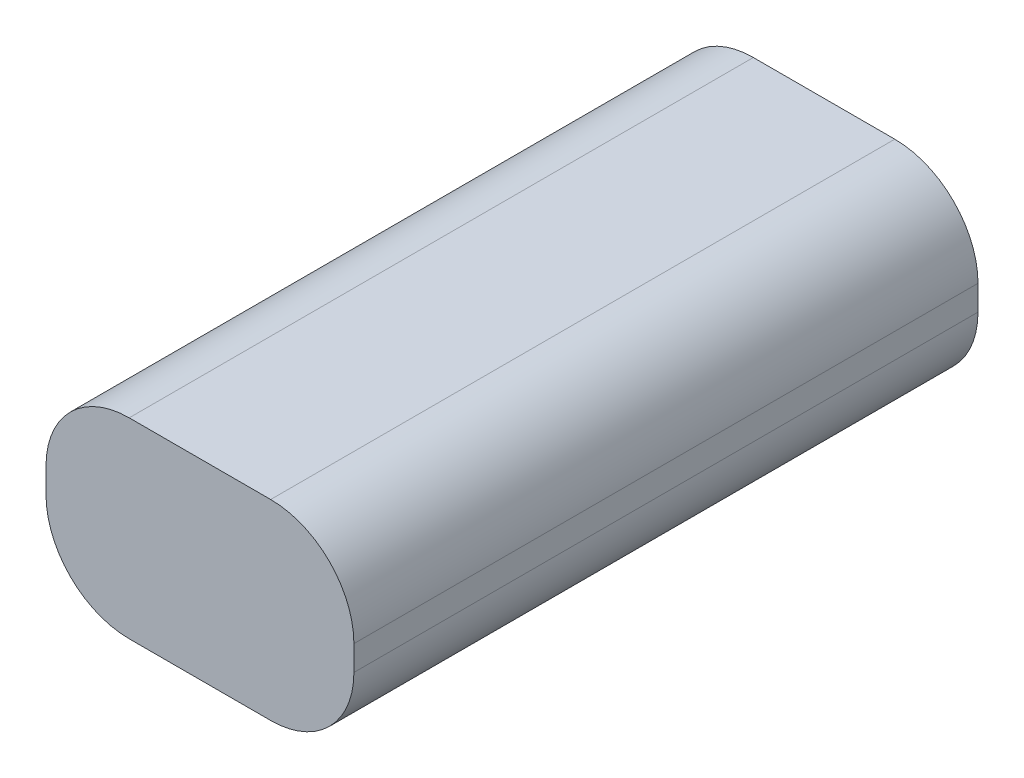
ISO-10303-21;
HEADER;
FILE_DESCRIPTION(('STEP AP214'),'2;1');
FILE_NAME('part.step','',(''),(''),'','','');
FILE_SCHEMA(('AUTOMOTIVE_DESIGN { 1 0 10303 214 1 1 1 1 }'));
ENDSEC;
DATA;
#1=APPLICATION_CONTEXT('core data for automotive mechanical design processes');
#2=APPLICATION_PROTOCOL_DEFINITION('international standard','automotive_design',2000,#1);
#3=PRODUCT_CONTEXT('',#1,'mechanical');
#4=PRODUCT('Part','Part','',(#3));
#5=PRODUCT_RELATED_PRODUCT_CATEGORY('part','',(#4));
#6=PRODUCT_DEFINITION_FORMATION('','',#4);
#7=PRODUCT_DEFINITION_CONTEXT('part definition',#1,'design');
#8=PRODUCT_DEFINITION('design','',#6,#7);
#9=PRODUCT_DEFINITION_SHAPE('','',#8);
#10=(LENGTH_UNIT() NAMED_UNIT(*) SI_UNIT(.MILLI.,.METRE.));
#11=(NAMED_UNIT(*) PLANE_ANGLE_UNIT() SI_UNIT($,.RADIAN.));
#12=(NAMED_UNIT(*) SI_UNIT($,.STERADIAN.) SOLID_ANGLE_UNIT());
#13=UNCERTAINTY_MEASURE_WITH_UNIT(LENGTH_MEASURE(1.E-05),#10,'distance_accuracy_value','');
#14=(GEOMETRIC_REPRESENTATION_CONTEXT(3) GLOBAL_UNCERTAINTY_ASSIGNED_CONTEXT((#13)) GLOBAL_UNIT_ASSIGNED_CONTEXT((#10,
#11,#12)) REPRESENTATION_CONTEXT('',''));
#15=CARTESIAN_POINT('',(0.,0.,0.));
#16=DIRECTION('',(0.,0.,1.));
#17=DIRECTION('',(1.,0.,0.));
#18=AXIS2_PLACEMENT_3D('',#15,#16,#17);
#19=CARTESIAN_POINT('',(18.5,23.,-37.5));
#20=DIRECTION('',(-1.,0.,0.));
#21=DIRECTION('',(0.,0.,1.));
#22=AXIS2_PLACEMENT_3D('',#19,#20,#21);
#23=PLANE('',#22);
#24=DIRECTION('',(0.,-1.,0.));
#25=VECTOR('',#24,1.);
#26=CARTESIAN_POINT('',(18.5,23.,37.5));
#27=LINE('',#26,#25);
#28=CARTESIAN_POINT('',(18.5,13.,37.5));
#29=VERTEX_POINT('',#28);
#30=CARTESIAN_POINT('',(18.5,10.,37.5));
#31=VERTEX_POINT('',#30);
#32=EDGE_CURVE('E134',#29,#31,#27,.T.);
#33=ORIENTED_EDGE('',*,*,#32,.T.);
#34=DIRECTION('',(0.,0.,-1.));
#35=VECTOR('',#34,1.);
#36=CARTESIAN_POINT('',(18.5,10.,-37.5));
#37=LINE('',#36,#35);
#38=CARTESIAN_POINT('',(18.5,10.,-37.5));
#39=VERTEX_POINT('',#38);
#40=EDGE_CURVE('E11',#31,#39,#37,.T.);
#41=ORIENTED_EDGE('',*,*,#40,.T.);
#42=DIRECTION('',(0.,-1.,0.));
#43=VECTOR('',#42,1.);
#44=CARTESIAN_POINT('',(18.5,23.,-37.5));
#45=LINE('',#44,#43);
#46=CARTESIAN_POINT('',(18.5,13.,-37.5));
#47=VERTEX_POINT('',#46);
#48=EDGE_CURVE('E140',#47,#39,#45,.T.);
#49=ORIENTED_EDGE('',*,*,#48,.F.);
#50=DIRECTION('',(0.,0.,-1.));
#51=VECTOR('',#50,1.);
#52=CARTESIAN_POINT('',(18.5,13.,37.5));
#53=LINE('',#52,#51);
#54=EDGE_CURVE('E52',#47,#29,#53,.F.);
#55=ORIENTED_EDGE('',*,*,#54,.T.);
#56=EDGE_LOOP('',(#33,#41,#49,#55));
#57=FACE_BOUND('',#56,.T.);
#58=ADVANCED_FACE('F43',(#57),#23,.F.);
#59=CARTESIAN_POINT('',(-18.5,23.,-37.5));
#60=DIRECTION('',(0.,0.,1.));
#61=DIRECTION('',(1.,0.,0.));
#62=AXIS2_PLACEMENT_3D('',#59,#60,#61);
#63=PLANE('',#62);
#64=DIRECTION('',(-1.,0.,0.));
#65=VECTOR('',#64,1.);
#66=CARTESIAN_POINT('',(-18.5,0.,-37.5));
#67=LINE('',#66,#65);
#68=CARTESIAN_POINT('',(8.49999999999999,0.,-37.5));
#69=VERTEX_POINT('',#68);
#70=CARTESIAN_POINT('',(-8.50000000000001,0.,-37.5));
#71=VERTEX_POINT('',#70);
#72=EDGE_CURVE('E200',#69,#71,#67,.T.);
#73=ORIENTED_EDGE('',*,*,#72,.T.);
#74=CARTESIAN_POINT('',(-8.50000000000001,10.,-37.5));
#75=DIRECTION('',(0.,0.,1.));
#76=DIRECTION('',(1.,0.,0.));
#77=AXIS2_PLACEMENT_3D('',#74,#75,#76);
#78=CIRCLE('',#77,10.);
#79=CARTESIAN_POINT('',(-18.5,10.,-37.5));
#80=VERTEX_POINT('',#79);
#81=EDGE_CURVE('E167',#71,#80,#78,.F.);
#82=ORIENTED_EDGE('',*,*,#81,.T.);
#83=DIRECTION('',(0.,-1.,0.));
#84=VECTOR('',#83,1.);
#85=CARTESIAN_POINT('',(-18.5,23.,-37.5));
#86=LINE('',#85,#84);
#87=CARTESIAN_POINT('',(-18.5,13.,-37.5));
#88=VERTEX_POINT('',#87);
#89=EDGE_CURVE('E133',#88,#80,#86,.T.);
#90=ORIENTED_EDGE('',*,*,#89,.F.);
#91=CARTESIAN_POINT('',(-8.50000000000001,13.,-37.5));
#92=DIRECTION('',(0.,0.,1.));
#93=DIRECTION('',(1.,0.,0.));
#94=AXIS2_PLACEMENT_3D('',#91,#92,#93);
#95=CIRCLE('',#94,10.);
#96=CARTESIAN_POINT('',(-8.50000000000001,23.,-37.5));
#97=VERTEX_POINT('',#96);
#98=EDGE_CURVE('E138',#88,#97,#95,.F.);
#99=ORIENTED_EDGE('',*,*,#98,.T.);
#100=DIRECTION('',(-1.,0.,0.));
#101=VECTOR('',#100,1.);
#102=CARTESIAN_POINT('',(-18.5,23.,-37.5));
#103=LINE('',#102,#101);
#104=CARTESIAN_POINT('',(8.49999999999999,23.,-37.5));
#105=VERTEX_POINT('',#104);
#106=EDGE_CURVE('E191',#105,#97,#103,.T.);
#107=ORIENTED_EDGE('',*,*,#106,.F.);
#108=CARTESIAN_POINT('',(8.49999999999999,13.,-37.5));
#109=DIRECTION('',(0.,0.,1.));
#110=DIRECTION('',(1.,0.,0.));
#111=AXIS2_PLACEMENT_3D('',#108,#109,#110);
#112=CIRCLE('',#111,10.);
#113=EDGE_CURVE('E66',#105,#47,#112,.F.);
#114=ORIENTED_EDGE('',*,*,#113,.T.);
#115=ORIENTED_EDGE('',*,*,#48,.T.);
#116=CARTESIAN_POINT('',(8.49999999999999,10.,-37.5));
#117=DIRECTION('',(0.,0.,1.));
#118=DIRECTION('',(1.,0.,0.));
#119=AXIS2_PLACEMENT_3D('',#116,#117,#118);
#120=CIRCLE('',#119,10.);
#121=EDGE_CURVE('E59',#39,#69,#120,.F.);
#122=ORIENTED_EDGE('',*,*,#121,.T.);
#123=EDGE_LOOP('',(#73,#82,#90,#99,#107,#114,#115,#122));
#124=FACE_BOUND('',#123,.T.);
#125=ADVANCED_FACE('F193',(#124),#63,.F.);
#126=CARTESIAN_POINT('',(-18.5,23.,-37.5));
#127=DIRECTION('',(1.,0.,0.));
#128=DIRECTION('',(0.,0.,-1.));
#129=AXIS2_PLACEMENT_3D('',#126,#127,#128);
#130=PLANE('',#129);
#131=ORIENTED_EDGE('',*,*,#89,.T.);
#132=DIRECTION('',(0.,0.,1.));
#133=VECTOR('',#132,1.);
#134=CARTESIAN_POINT('',(-18.5,10.,-37.5));
#135=LINE('',#134,#133);
#136=CARTESIAN_POINT('',(-18.5,10.,37.5));
#137=VERTEX_POINT('',#136);
#138=EDGE_CURVE('E131',#80,#137,#135,.T.);
#139=ORIENTED_EDGE('',*,*,#138,.T.);
#140=DIRECTION('',(0.,-1.,0.));
#141=VECTOR('',#140,1.);
#142=CARTESIAN_POINT('',(-18.5,23.,37.5));
#143=LINE('',#142,#141);
#144=CARTESIAN_POINT('',(-18.5,13.,37.5));
#145=VERTEX_POINT('',#144);
#146=EDGE_CURVE('E113',#145,#137,#143,.T.);
#147=ORIENTED_EDGE('',*,*,#146,.F.);
#148=DIRECTION('',(0.,0.,1.));
#149=VECTOR('',#148,1.);
#150=CARTESIAN_POINT('',(-18.5,13.,-37.5));
#151=LINE('',#150,#149);
#152=EDGE_CURVE('E128',#145,#88,#151,.F.);
#153=ORIENTED_EDGE('',*,*,#152,.T.);
#154=EDGE_LOOP('',(#131,#139,#147,#153));
#155=FACE_BOUND('',#154,.T.);
#156=ADVANCED_FACE('F127',(#155),#130,.F.);
#157=CARTESIAN_POINT('',(-18.5,23.,37.5));
#158=DIRECTION('',(0.,0.,-1.));
#159=DIRECTION('',(-1.,0.,0.));
#160=AXIS2_PLACEMENT_3D('',#157,#158,#159);
#161=PLANE('',#160);
#162=ORIENTED_EDGE('',*,*,#146,.T.);
#163=CARTESIAN_POINT('',(-8.49999999999999,10.,37.5));
#164=DIRECTION('',(0.,0.,-1.));
#165=DIRECTION('',(-1.,0.,0.));
#166=AXIS2_PLACEMENT_3D('',#163,#164,#165);
#167=CIRCLE('',#166,10.);
#168=CARTESIAN_POINT('',(-8.49999999999999,0.,37.5));
#169=VERTEX_POINT('',#168);
#170=EDGE_CURVE('E121',#137,#169,#167,.F.);
#171=ORIENTED_EDGE('',*,*,#170,.T.);
#172=DIRECTION('',(1.,0.,0.));
#173=VECTOR('',#172,1.);
#174=CARTESIAN_POINT('',(-18.5,0.,37.5));
#175=LINE('',#174,#173);
#176=CARTESIAN_POINT('',(8.5,0.,37.5));
#177=VERTEX_POINT('',#176);
#178=EDGE_CURVE('E195',#169,#177,#175,.T.);
#179=ORIENTED_EDGE('',*,*,#178,.T.);
#180=CARTESIAN_POINT('',(8.5,10.,37.5));
#181=DIRECTION('',(0.,0.,-1.));
#182=DIRECTION('',(-1.,0.,0.));
#183=AXIS2_PLACEMENT_3D('',#180,#181,#182);
#184=CIRCLE('',#183,10.);
#185=EDGE_CURVE('E122',#177,#31,#184,.F.);
#186=ORIENTED_EDGE('',*,*,#185,.T.);
#187=ORIENTED_EDGE('',*,*,#32,.F.);
#188=CARTESIAN_POINT('',(8.5,13.,37.5));
#189=DIRECTION('',(0.,0.,-1.));
#190=DIRECTION('',(-1.,0.,0.));
#191=AXIS2_PLACEMENT_3D('',#188,#189,#190);
#192=CIRCLE('',#191,10.);
#193=CARTESIAN_POINT('',(8.5,23.,37.5));
#194=VERTEX_POINT('',#193);
#195=EDGE_CURVE('E144',#29,#194,#192,.F.);
#196=ORIENTED_EDGE('',*,*,#195,.T.);
#197=DIRECTION('',(1.,0.,0.));
#198=VECTOR('',#197,1.);
#199=CARTESIAN_POINT('',(-18.5,23.,37.5));
#200=LINE('',#199,#198);
#201=CARTESIAN_POINT('',(-8.49999999999999,23.,37.5));
#202=VERTEX_POINT('',#201);
#203=EDGE_CURVE('E115',#202,#194,#200,.T.);
#204=ORIENTED_EDGE('',*,*,#203,.F.);
#205=CARTESIAN_POINT('',(-8.49999999999999,13.,37.5));
#206=DIRECTION('',(0.,0.,-1.));
#207=DIRECTION('',(-1.,0.,0.));
#208=AXIS2_PLACEMENT_3D('',#205,#206,#207);
#209=CIRCLE('',#208,10.);
#210=EDGE_CURVE('E110',#202,#145,#209,.F.);
#211=ORIENTED_EDGE('',*,*,#210,.T.);
#212=EDGE_LOOP('',(#162,#171,#179,#186,#187,#196,#204,#211));
#213=FACE_BOUND('',#212,.T.);
#214=ADVANCED_FACE('F112',(#213),#161,.F.);
#215=CARTESIAN_POINT('',(0.,23.,0.));
#216=DIRECTION('',(0.,1.,0.));
#217=DIRECTION('',(0.,0.,1.));
#218=AXIS2_PLACEMENT_3D('',#215,#216,#217);
#219=PLANE('',#218);
#220=ORIENTED_EDGE('',*,*,#106,.T.);
#221=DIRECTION('',(0.,0.,1.));
#222=VECTOR('',#221,1.);
#223=CARTESIAN_POINT('',(-8.49999999999999,23.,37.5));
#224=LINE('',#223,#222);
#225=EDGE_CURVE('E174',#97,#202,#224,.T.);
#226=ORIENTED_EDGE('',*,*,#225,.T.);
#227=ORIENTED_EDGE('',*,*,#203,.T.);
#228=DIRECTION('',(0.,0.,-1.));
#229=VECTOR('',#228,1.);
#230=CARTESIAN_POINT('',(8.49999999999999,23.,-37.5));
#231=LINE('',#230,#229);
#232=EDGE_CURVE('E170',#194,#105,#231,.T.);
#233=ORIENTED_EDGE('',*,*,#232,.T.);
#234=EDGE_LOOP('',(#220,#226,#227,#233));
#235=FACE_BOUND('',#234,.T.);
#236=ADVANCED_FACE('F190',(#235),#219,.T.);
#237=CARTESIAN_POINT('',(0.,0.,0.));
#238=DIRECTION('',(0.,1.,0.));
#239=DIRECTION('',(0.,0.,1.));
#240=AXIS2_PLACEMENT_3D('',#237,#238,#239);
#241=PLANE('',#240);
#242=ORIENTED_EDGE('',*,*,#178,.F.);
#243=DIRECTION('',(0.,0.,1.));
#244=VECTOR('',#243,1.);
#245=CARTESIAN_POINT('',(-8.5,0.,0.));
#246=LINE('',#245,#244);
#247=EDGE_CURVE('E158',#169,#71,#246,.F.);
#248=ORIENTED_EDGE('',*,*,#247,.T.);
#249=ORIENTED_EDGE('',*,*,#72,.F.);
#250=DIRECTION('',(0.,0.,-1.));
#251=VECTOR('',#250,1.);
#252=CARTESIAN_POINT('',(8.49999999999999,0.,0.));
#253=LINE('',#252,#251);
#254=EDGE_CURVE('E155',#69,#177,#253,.F.);
#255=ORIENTED_EDGE('',*,*,#254,.T.);
#256=EDGE_LOOP('',(#242,#248,#249,#255));
#257=FACE_BOUND('',#256,.T.);
#258=ADVANCED_FACE('F211',(#257),#241,.F.);
#259=CARTESIAN_POINT('',(-8.50000000000001,10.,-37.5));
#260=DIRECTION('',(0.,0.,1.));
#261=DIRECTION('',(1.,0.,0.));
#262=AXIS2_PLACEMENT_3D('',#259,#260,#261);
#263=CYLINDRICAL_SURFACE('',#262,10.);
#264=ORIENTED_EDGE('',*,*,#81,.F.);
#265=ORIENTED_EDGE('',*,*,#247,.F.);
#266=ORIENTED_EDGE('',*,*,#170,.F.);
#267=ORIENTED_EDGE('',*,*,#138,.F.);
#268=EDGE_LOOP('',(#264,#265,#266,#267));
#269=FACE_BOUND('',#268,.T.);
#270=ADVANCED_FACE('F207',(#269),#263,.T.);
#271=CARTESIAN_POINT('',(-8.5,13.,0.));
#272=DIRECTION('',(0.,0.,-1.));
#273=DIRECTION('',(-1.,0.,0.));
#274=AXIS2_PLACEMENT_3D('',#271,#272,#273);
#275=CYLINDRICAL_SURFACE('',#274,10.);
#276=ORIENTED_EDGE('',*,*,#98,.F.);
#277=ORIENTED_EDGE('',*,*,#152,.F.);
#278=ORIENTED_EDGE('',*,*,#210,.F.);
#279=ORIENTED_EDGE('',*,*,#225,.F.);
#280=EDGE_LOOP('',(#276,#277,#278,#279));
#281=FACE_BOUND('',#280,.T.);
#282=ADVANCED_FACE('F137',(#281),#275,.T.);
#283=CARTESIAN_POINT('',(8.49999999999999,10.,-37.5));
#284=DIRECTION('',(0.,0.,-1.));
#285=DIRECTION('',(-1.,0.,0.));
#286=AXIS2_PLACEMENT_3D('',#283,#284,#285);
#287=CYLINDRICAL_SURFACE('',#286,10.);
#288=ORIENTED_EDGE('',*,*,#185,.F.);
#289=ORIENTED_EDGE('',*,*,#254,.F.);
#290=ORIENTED_EDGE('',*,*,#121,.F.);
#291=ORIENTED_EDGE('',*,*,#40,.F.);
#292=EDGE_LOOP('',(#288,#289,#290,#291));
#293=FACE_BOUND('',#292,.T.);
#294=ADVANCED_FACE('F213',(#293),#287,.T.);
#295=CARTESIAN_POINT('',(8.49999999999999,13.,0.));
#296=DIRECTION('',(0.,0.,1.));
#297=DIRECTION('',(1.,0.,0.));
#298=AXIS2_PLACEMENT_3D('',#295,#296,#297);
#299=CYLINDRICAL_SURFACE('',#298,10.);
#300=ORIENTED_EDGE('',*,*,#195,.F.);
#301=ORIENTED_EDGE('',*,*,#54,.F.);
#302=ORIENTED_EDGE('',*,*,#113,.F.);
#303=ORIENTED_EDGE('',*,*,#232,.F.);
#304=EDGE_LOOP('',(#300,#301,#302,#303));
#305=FACE_BOUND('',#304,.T.);
#306=ADVANCED_FACE('F45',(#305),#299,.T.);
#307=CLOSED_SHELL('',(#58,#125,#156,#214,#236,#258,#270,#282,#294,#306));
#308=MANIFOLD_SOLID_BREP('B2',#307);
#309=ADVANCED_BREP_SHAPE_REPRESENTATION('',(#18,#308),#14);
#310=SHAPE_DEFINITION_REPRESENTATION(#9,#309);
ENDSEC;
END-ISO-10303-21;
